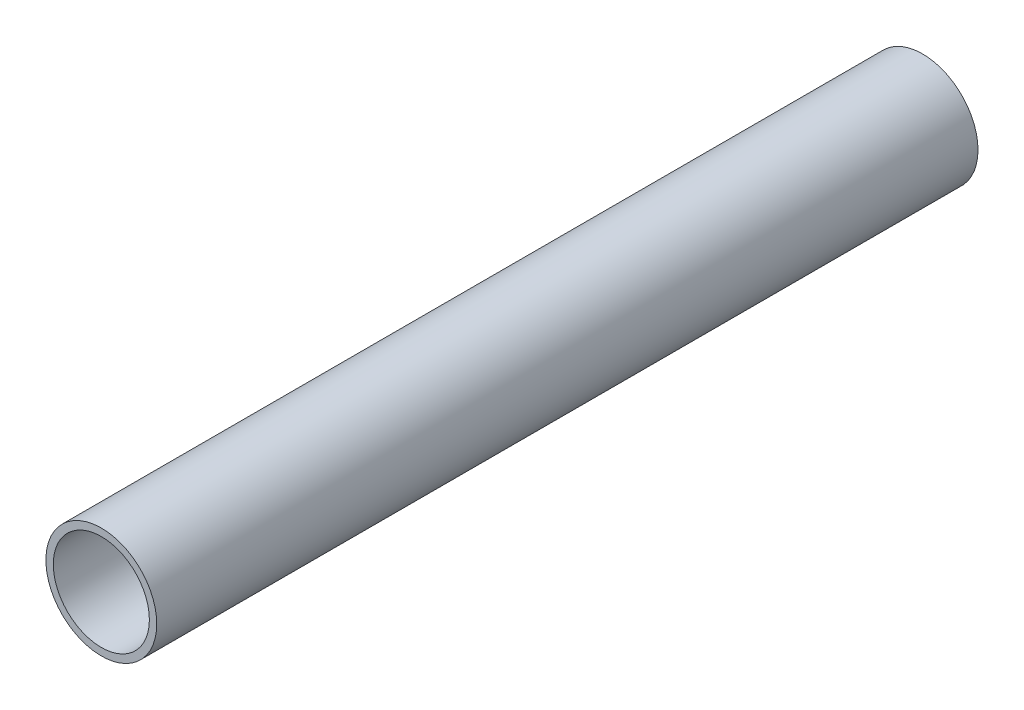
ISO-10303-21;
HEADER;
FILE_DESCRIPTION(('STEP AP214'),'2;1');
FILE_NAME('part.step','',(''),(''),'','','');
FILE_SCHEMA(('AUTOMOTIVE_DESIGN { 1 0 10303 214 1 1 1 1 }'));
ENDSEC;
DATA;
#1=APPLICATION_CONTEXT('core data for automotive mechanical design processes');
#2=APPLICATION_PROTOCOL_DEFINITION('international standard','automotive_design',2000,#1);
#3=PRODUCT_CONTEXT('',#1,'mechanical');
#4=PRODUCT('Part','Part','',(#3));
#5=PRODUCT_RELATED_PRODUCT_CATEGORY('part','',(#4));
#6=PRODUCT_DEFINITION_FORMATION('','',#4);
#7=PRODUCT_DEFINITION_CONTEXT('part definition',#1,'design');
#8=PRODUCT_DEFINITION('design','',#6,#7);
#9=PRODUCT_DEFINITION_SHAPE('','',#8);
#10=(LENGTH_UNIT() NAMED_UNIT(*) SI_UNIT(.MILLI.,.METRE.));
#11=(NAMED_UNIT(*) PLANE_ANGLE_UNIT() SI_UNIT($,.RADIAN.));
#12=(NAMED_UNIT(*) SI_UNIT($,.STERADIAN.) SOLID_ANGLE_UNIT());
#13=UNCERTAINTY_MEASURE_WITH_UNIT(LENGTH_MEASURE(1.E-05),#10,'distance_accuracy_value','');
#14=(GEOMETRIC_REPRESENTATION_CONTEXT(3) GLOBAL_UNCERTAINTY_ASSIGNED_CONTEXT((#13)) GLOBAL_UNIT_ASSIGNED_CONTEXT((#10,
#11,#12)) REPRESENTATION_CONTEXT('',''));
#15=CARTESIAN_POINT('',(0.,0.,0.));
#16=DIRECTION('',(0.,0.,1.));
#17=DIRECTION('',(1.,0.,0.));
#18=AXIS2_PLACEMENT_3D('',#15,#16,#17);
#19=CARTESIAN_POINT('',(0.,0.,200.));
#20=DIRECTION('',(0.,0.,1.));
#21=DIRECTION('',(1.,0.,0.));
#22=AXIS2_PLACEMENT_3D('',#19,#20,#21);
#23=PLANE('',#22);
#24=CARTESIAN_POINT('',(0.,0.,200.));
#25=DIRECTION('',(0.,0.,1.));
#26=DIRECTION('',(1.,0.,0.));
#27=AXIS2_PLACEMENT_3D('',#24,#25,#26);
#28=CIRCLE('',#27,13.5);
#29=CARTESIAN_POINT('',(13.5,0.,200.));
#30=VERTEX_POINT('',#29);
#31=EDGE_CURVE('E10',#30,#30,#28,.T.);
#32=ORIENTED_EDGE('',*,*,#31,.T.);
#33=EDGE_LOOP('',(#32));
#34=FACE_BOUND('',#33,.T.);
#35=CARTESIAN_POINT('',(0.,0.,200.));
#36=DIRECTION('',(0.,0.,1.));
#37=DIRECTION('',(1.,0.,0.));
#38=AXIS2_PLACEMENT_3D('',#35,#36,#37);
#39=CIRCLE('',#38,11.7);
#40=CARTESIAN_POINT('',(11.7,0.,200.));
#41=VERTEX_POINT('',#40);
#42=EDGE_CURVE('E41',#41,#41,#39,.T.);
#43=ORIENTED_EDGE('',*,*,#42,.F.);
#44=EDGE_LOOP('',(#43));
#45=FACE_BOUND('',#44,.T.);
#46=ADVANCED_FACE('F30',(#34,#45),#23,.T.);
#47=CARTESIAN_POINT('',(0.,0.,0.));
#48=DIRECTION('',(0.,0.,1.));
#49=DIRECTION('',(1.,0.,0.));
#50=AXIS2_PLACEMENT_3D('',#47,#48,#49);
#51=PLANE('',#50);
#52=CARTESIAN_POINT('',(0.,0.,0.));
#53=DIRECTION('',(0.,0.,1.));
#54=DIRECTION('',(1.,0.,0.));
#55=AXIS2_PLACEMENT_3D('',#52,#53,#54);
#56=CIRCLE('',#55,13.5);
#57=CARTESIAN_POINT('',(13.5,0.,0.));
#58=VERTEX_POINT('',#57);
#59=EDGE_CURVE('E34',#58,#58,#56,.T.);
#60=ORIENTED_EDGE('',*,*,#59,.F.);
#61=EDGE_LOOP('',(#60));
#62=FACE_BOUND('',#61,.T.);
#63=CARTESIAN_POINT('',(0.,0.,0.));
#64=DIRECTION('',(0.,0.,1.));
#65=DIRECTION('',(1.,0.,0.));
#66=AXIS2_PLACEMENT_3D('',#63,#64,#65);
#67=CIRCLE('',#66,11.7);
#68=CARTESIAN_POINT('',(11.7,0.,0.));
#69=VERTEX_POINT('',#68);
#70=EDGE_CURVE('E43',#69,#69,#67,.T.);
#71=ORIENTED_EDGE('',*,*,#70,.T.);
#72=EDGE_LOOP('',(#71));
#73=FACE_BOUND('',#72,.T.);
#74=ADVANCED_FACE('F53',(#62,#73),#51,.F.);
#75=CARTESIAN_POINT('',(0.,0.,200.));
#76=DIRECTION('',(0.,0.,-1.));
#77=DIRECTION('',(-1.,0.,0.));
#78=AXIS2_PLACEMENT_3D('',#75,#76,#77);
#79=CYLINDRICAL_SURFACE('',#78,13.5);
#80=ORIENTED_EDGE('',*,*,#31,.F.);
#81=EDGE_LOOP('',(#80));
#82=FACE_BOUND('',#81,.T.);
#83=ORIENTED_EDGE('',*,*,#59,.T.);
#84=EDGE_LOOP('',(#83));
#85=FACE_BOUND('',#84,.T.);
#86=ADVANCED_FACE('F32',(#82,#85),#79,.T.);
#87=CARTESIAN_POINT('',(0.,0.,200.));
#88=DIRECTION('',(0.,0.,-1.));
#89=DIRECTION('',(-1.,0.,0.));
#90=AXIS2_PLACEMENT_3D('',#87,#88,#89);
#91=CYLINDRICAL_SURFACE('',#90,11.7);
#92=ORIENTED_EDGE('',*,*,#42,.T.);
#93=EDGE_LOOP('',(#92));
#94=FACE_BOUND('',#93,.T.);
#95=ORIENTED_EDGE('',*,*,#70,.F.);
#96=EDGE_LOOP('',(#95));
#97=FACE_BOUND('',#96,.T.);
#98=ADVANCED_FACE('F49',(#94,#97),#91,.F.);
#99=CLOSED_SHELL('',(#46,#74,#86,#98));
#100=MANIFOLD_SOLID_BREP('B2',#99);
#101=ADVANCED_BREP_SHAPE_REPRESENTATION('',(#18,#100),#14);
#102=SHAPE_DEFINITION_REPRESENTATION(#9,#101);
ENDSEC;
END-ISO-10303-21;
